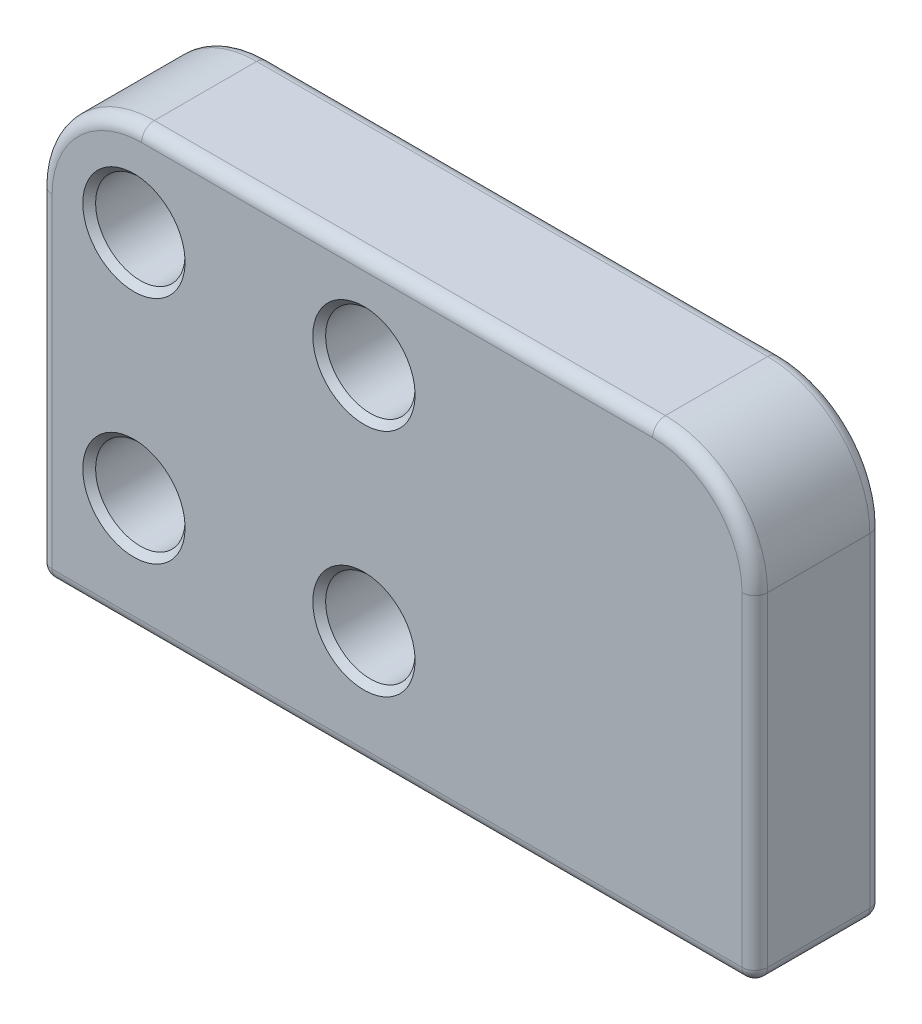
ISO-10303-21;
HEADER;
FILE_DESCRIPTION(('STEP AP214'),'2;1');
FILE_NAME('part.step','',(''),(''),'','','');
FILE_SCHEMA(('AUTOMOTIVE_DESIGN { 1 0 10303 214 1 1 1 1 }'));
ENDSEC;
DATA;
#1=APPLICATION_CONTEXT('core data for automotive mechanical design processes');
#2=APPLICATION_PROTOCOL_DEFINITION('international standard','automotive_design',2000,#1);
#3=PRODUCT_CONTEXT('',#1,'mechanical');
#4=PRODUCT('Part','Part','',(#3));
#5=PRODUCT_RELATED_PRODUCT_CATEGORY('part','',(#4));
#6=PRODUCT_DEFINITION_FORMATION('','',#4);
#7=PRODUCT_DEFINITION_CONTEXT('part definition',#1,'design');
#8=PRODUCT_DEFINITION('design','',#6,#7);
#9=PRODUCT_DEFINITION_SHAPE('','',#8);
#10=(LENGTH_UNIT() NAMED_UNIT(*) SI_UNIT(.MILLI.,.METRE.));
#11=(NAMED_UNIT(*) PLANE_ANGLE_UNIT() SI_UNIT($,.RADIAN.));
#12=(NAMED_UNIT(*) SI_UNIT($,.STERADIAN.) SOLID_ANGLE_UNIT());
#13=UNCERTAINTY_MEASURE_WITH_UNIT(LENGTH_MEASURE(1.E-05),#10,'distance_accuracy_value','');
#14=(GEOMETRIC_REPRESENTATION_CONTEXT(3) GLOBAL_UNCERTAINTY_ASSIGNED_CONTEXT((#13)) GLOBAL_UNIT_ASSIGNED_CONTEXT((#10,
#11,#12)) REPRESENTATION_CONTEXT('',''));
#15=CARTESIAN_POINT('',(0.,0.,0.));
#16=DIRECTION('',(0.,0.,1.));
#17=DIRECTION('',(1.,0.,0.));
#18=AXIS2_PLACEMENT_3D('',#15,#16,#17);
#19=CARTESIAN_POINT('',(24.7014572283037,41.,0.));
#20=DIRECTION('',(0.,1.,0.));
#21=DIRECTION('',(0.,0.,1.));
#22=AXIS2_PLACEMENT_3D('',#19,#20,#21);
#23=PLANE('',#22);
#24=DIRECTION('',(0.,0.,-1.));
#25=VECTOR('',#24,1.);
#26=CARTESIAN_POINT('',(9.,41.,0.));
#27=LINE('',#26,#25);
#28=CARTESIAN_POINT('',(9.,41.,1.));
#29=VERTEX_POINT('',#28);
#30=CARTESIAN_POINT('',(9.,41.,9.));
#31=VERTEX_POINT('',#30);
#32=EDGE_CURVE('E470',#29,#31,#27,.F.);
#33=ORIENTED_EDGE('',*,*,#32,.T.);
#34=DIRECTION('',(1.,0.,0.));
#35=VECTOR('',#34,1.);
#36=CARTESIAN_POINT('',(24.7014572283037,41.,9.));
#37=LINE('',#36,#35);
#38=CARTESIAN_POINT('',(-44.99,41.,9.));
#39=VERTEX_POINT('',#38);
#40=EDGE_CURVE('E227',#31,#39,#37,.F.);
#41=ORIENTED_EDGE('',*,*,#40,.T.);
#42=DIRECTION('',(0.,0.,1.));
#43=VECTOR('',#42,1.);
#44=CARTESIAN_POINT('',(-44.99,41.,0.));
#45=LINE('',#44,#43);
#46=CARTESIAN_POINT('',(-44.99,41.,1.));
#47=VERTEX_POINT('',#46);
#48=EDGE_CURVE('E476',#39,#47,#45,.F.);
#49=ORIENTED_EDGE('',*,*,#48,.T.);
#50=DIRECTION('',(1.,0.,0.));
#51=VECTOR('',#50,1.);
#52=CARTESIAN_POINT('',(10.,41.,1.));
#53=LINE('',#52,#51);
#54=EDGE_CURVE('E473',#47,#29,#53,.T.);
#55=ORIENTED_EDGE('',*,*,#54,.T.);
#56=EDGE_LOOP('',(#33,#41,#49,#55));
#57=FACE_BOUND('',#56,.T.);
#58=ADVANCED_FACE('F61',(#57),#23,.F.);
#59=CARTESIAN_POINT('',(-38.59,50.,10.));
#60=DIRECTION('',(0.,0.,-1.));
#61=DIRECTION('',(-1.,0.,0.));
#62=AXIS2_PLACEMENT_3D('',#59,#60,#61);
#63=CYLINDRICAL_SURFACE('',#62,3.5);
#64=CARTESIAN_POINT('',(-38.59,50.,0.499999999999994));
#65=DIRECTION('',(0.,0.,-1.));
#66=DIRECTION('',(-1.,0.,0.));
#67=AXIS2_PLACEMENT_3D('',#64,#65,#66);
#68=CIRCLE('',#67,3.5);
#69=CARTESIAN_POINT('',(-42.09,50.,0.499999999999994));
#70=VERTEX_POINT('',#69);
#71=EDGE_CURVE('E325',#70,#70,#68,.T.);
#72=ORIENTED_EDGE('',*,*,#71,.T.);
#73=EDGE_LOOP('',(#72));
#74=FACE_BOUND('',#73,.T.);
#75=CARTESIAN_POINT('',(-38.59,50.,9.49999999999999));
#76=DIRECTION('',(0.,0.,-1.));
#77=DIRECTION('',(-1.,0.,0.));
#78=AXIS2_PLACEMENT_3D('',#75,#76,#77);
#79=CIRCLE('',#78,3.5);
#80=CARTESIAN_POINT('',(-42.09,50.,9.49999999999999));
#81=VERTEX_POINT('',#80);
#82=EDGE_CURVE('E321',#81,#81,#79,.F.);
#83=ORIENTED_EDGE('',*,*,#82,.T.);
#84=EDGE_LOOP('',(#83));
#85=FACE_BOUND('',#84,.T.);
#86=ADVANCED_FACE('F354',(#74,#85),#63,.F.);
#87=CARTESIAN_POINT('',(-20.59,68.,10.));
#88=DIRECTION('',(0.,0.,-1.));
#89=DIRECTION('',(-1.,0.,0.));
#90=AXIS2_PLACEMENT_3D('',#87,#88,#89);
#91=CYLINDRICAL_SURFACE('',#90,3.5);
#92=CARTESIAN_POINT('',(-20.59,68.,0.500000000000007));
#93=DIRECTION('',(0.,0.,-1.));
#94=DIRECTION('',(-1.,0.,0.));
#95=AXIS2_PLACEMENT_3D('',#92,#93,#94);
#96=CIRCLE('',#95,3.5);
#97=CARTESIAN_POINT('',(-24.09,68.,0.500000000000007));
#98=VERTEX_POINT('',#97);
#99=EDGE_CURVE('E333',#98,#98,#96,.T.);
#100=ORIENTED_EDGE('',*,*,#99,.T.);
#101=EDGE_LOOP('',(#100));
#102=FACE_BOUND('',#101,.T.);
#103=CARTESIAN_POINT('',(-20.59,68.,9.49999999999999));
#104=DIRECTION('',(0.,0.,-1.));
#105=DIRECTION('',(-1.,0.,0.));
#106=AXIS2_PLACEMENT_3D('',#103,#104,#105);
#107=CIRCLE('',#106,3.5);
#108=CARTESIAN_POINT('',(-24.09,68.,9.49999999999999));
#109=VERTEX_POINT('',#108);
#110=EDGE_CURVE('E329',#109,#109,#107,.F.);
#111=ORIENTED_EDGE('',*,*,#110,.T.);
#112=EDGE_LOOP('',(#111));
#113=FACE_BOUND('',#112,.T.);
#114=ADVANCED_FACE('F362',(#102,#113),#91,.F.);
#115=CARTESIAN_POINT('',(-20.59,50.,10.));
#116=DIRECTION('',(0.,0.,-1.));
#117=DIRECTION('',(-1.,0.,0.));
#118=AXIS2_PLACEMENT_3D('',#115,#116,#117);
#119=CYLINDRICAL_SURFACE('',#118,3.5);
#120=CARTESIAN_POINT('',(-20.59,50.,0.500000000000007));
#121=DIRECTION('',(0.,0.,-1.));
#122=DIRECTION('',(-1.,0.,0.));
#123=AXIS2_PLACEMENT_3D('',#120,#121,#122);
#124=CIRCLE('',#123,3.5);
#125=CARTESIAN_POINT('',(-24.09,50.,0.500000000000007));
#126=VERTEX_POINT('',#125);
#127=EDGE_CURVE('E301',#126,#126,#124,.T.);
#128=ORIENTED_EDGE('',*,*,#127,.T.);
#129=EDGE_LOOP('',(#128));
#130=FACE_BOUND('',#129,.T.);
#131=CARTESIAN_POINT('',(-20.59,50.,9.49999999999999));
#132=DIRECTION('',(0.,0.,-1.));
#133=DIRECTION('',(-1.,0.,0.));
#134=AXIS2_PLACEMENT_3D('',#131,#132,#133);
#135=CIRCLE('',#134,3.5);
#136=CARTESIAN_POINT('',(-24.09,50.,9.49999999999999));
#137=VERTEX_POINT('',#136);
#138=EDGE_CURVE('E297',#137,#137,#135,.F.);
#139=ORIENTED_EDGE('',*,*,#138,.T.);
#140=EDGE_LOOP('',(#139));
#141=FACE_BOUND('',#140,.T.);
#142=ADVANCED_FACE('F570',(#130,#141),#119,.F.);
#143=CARTESIAN_POINT('',(-38.59,68.,10.));
#144=DIRECTION('',(0.,0.,-1.));
#145=DIRECTION('',(-1.,0.,0.));
#146=AXIS2_PLACEMENT_3D('',#143,#144,#145);
#147=CYLINDRICAL_SURFACE('',#146,3.5);
#148=CARTESIAN_POINT('',(-38.59,68.,0.499999999999994));
#149=DIRECTION('',(0.,0.,-1.));
#150=DIRECTION('',(-1.,0.,0.));
#151=AXIS2_PLACEMENT_3D('',#148,#149,#150);
#152=CIRCLE('',#151,3.5);
#153=CARTESIAN_POINT('',(-42.09,68.,0.499999999999994));
#154=VERTEX_POINT('',#153);
#155=EDGE_CURVE('E12',#154,#154,#152,.T.);
#156=ORIENTED_EDGE('',*,*,#155,.T.);
#157=EDGE_LOOP('',(#156));
#158=FACE_BOUND('',#157,.T.);
#159=CARTESIAN_POINT('',(-38.59,68.,9.49999999999999));
#160=DIRECTION('',(0.,0.,-1.));
#161=DIRECTION('',(-1.,0.,0.));
#162=AXIS2_PLACEMENT_3D('',#159,#160,#161);
#163=CIRCLE('',#162,3.5);
#164=CARTESIAN_POINT('',(-42.09,68.,9.49999999999999));
#165=VERTEX_POINT('',#164);
#166=EDGE_CURVE('E71',#165,#165,#163,.F.);
#167=ORIENTED_EDGE('',*,*,#166,.T.);
#168=EDGE_LOOP('',(#167));
#169=FACE_BOUND('',#168,.T.);
#170=ADVANCED_FACE('F341',(#158,#169),#147,.F.);
#171=CARTESIAN_POINT('',(-45.99,75.4,10.));
#172=DIRECTION('',(0.,-1.,0.));
#173=DIRECTION('',(0.,0.,-1.));
#174=AXIS2_PLACEMENT_3D('',#171,#172,#173);
#175=PLANE('',#174);
#176=DIRECTION('',(0.,0.,-1.));
#177=VECTOR('',#176,1.);
#178=CARTESIAN_POINT('',(-37.99,75.4,10.));
#179=LINE('',#178,#177);
#180=CARTESIAN_POINT('',(-37.99,75.4,0.999999999999999));
#181=VERTEX_POINT('',#180);
#182=CARTESIAN_POINT('',(-37.99,75.4,9.));
#183=VERTEX_POINT('',#182);
#184=EDGE_CURVE('E214',#181,#183,#179,.F.);
#185=ORIENTED_EDGE('',*,*,#184,.T.);
#186=DIRECTION('',(-1.,0.,0.));
#187=VECTOR('',#186,1.);
#188=CARTESIAN_POINT('',(-45.99,75.4,9.));
#189=LINE('',#188,#187);
#190=CARTESIAN_POINT('',(1.99999999999999,75.4,9.));
#191=VERTEX_POINT('',#190);
#192=EDGE_CURVE('E416',#183,#191,#189,.F.);
#193=ORIENTED_EDGE('',*,*,#192,.T.);
#194=DIRECTION('',(0.,0.,-1.));
#195=VECTOR('',#194,1.);
#196=CARTESIAN_POINT('',(1.99999999999999,75.4,10.));
#197=LINE('',#196,#195);
#198=CARTESIAN_POINT('',(1.99999999999999,75.4,0.999999999999999));
#199=VERTEX_POINT('',#198);
#200=EDGE_CURVE('E395',#191,#199,#197,.T.);
#201=ORIENTED_EDGE('',*,*,#200,.T.);
#202=DIRECTION('',(-1.,0.,0.));
#203=VECTOR('',#202,1.);
#204=CARTESIAN_POINT('',(-37.99,75.4,0.999999999999999));
#205=LINE('',#204,#203);
#206=EDGE_CURVE('E445',#199,#181,#205,.T.);
#207=ORIENTED_EDGE('',*,*,#206,.T.);
#208=EDGE_LOOP('',(#185,#193,#201,#207));
#209=FACE_BOUND('',#208,.T.);
#210=ADVANCED_FACE('F383',(#209),#175,.F.);
#211=CARTESIAN_POINT('',(1.99999999999999,67.4,10.));
#212=DIRECTION('',(0.,0.,-1.));
#213=DIRECTION('',(-1.,0.,0.));
#214=AXIS2_PLACEMENT_3D('',#211,#212,#213);
#215=CYLINDRICAL_SURFACE('',#214,8.);
#216=ORIENTED_EDGE('',*,*,#200,.F.);
#217=CARTESIAN_POINT('',(1.99999999999999,67.4,9.));
#218=DIRECTION('',(0.,0.,-1.));
#219=DIRECTION('',(-1.,0.,0.));
#220=AXIS2_PLACEMENT_3D('',#217,#218,#219);
#221=CIRCLE('',#220,8.);
#222=CARTESIAN_POINT('',(9.99999999999999,67.4,9.));
#223=VERTEX_POINT('',#222);
#224=EDGE_CURVE('E398',#191,#223,#221,.T.);
#225=ORIENTED_EDGE('',*,*,#224,.T.);
#226=DIRECTION('',(0.,0.,-1.));
#227=VECTOR('',#226,1.);
#228=CARTESIAN_POINT('',(9.99999999999999,67.4,10.));
#229=LINE('',#228,#227);
#230=CARTESIAN_POINT('',(9.99999999999999,67.4,0.999999999999999));
#231=VERTEX_POINT('',#230);
#232=EDGE_CURVE('E280',#231,#223,#229,.F.);
#233=ORIENTED_EDGE('',*,*,#232,.F.);
#234=CARTESIAN_POINT('',(1.99999999999999,67.4,0.999999999999999));
#235=DIRECTION('',(0.,0.,-1.));
#236=DIRECTION('',(-1.,0.,0.));
#237=AXIS2_PLACEMENT_3D('',#234,#235,#236);
#238=CIRCLE('',#237,8.);
#239=EDGE_CURVE('E400',#231,#199,#238,.F.);
#240=ORIENTED_EDGE('',*,*,#239,.T.);
#241=EDGE_LOOP('',(#216,#225,#233,#240));
#242=FACE_BOUND('',#241,.T.);
#243=ADVANCED_FACE('F386',(#242),#215,.T.);
#244=CARTESIAN_POINT('',(-37.99,67.4,10.));
#245=DIRECTION('',(0.,0.,-1.));
#246=DIRECTION('',(-1.,0.,0.));
#247=AXIS2_PLACEMENT_3D('',#244,#245,#246);
#248=CYLINDRICAL_SURFACE('',#247,8.);
#249=DIRECTION('',(0.,0.,-1.));
#250=VECTOR('',#249,1.);
#251=CARTESIAN_POINT('',(-45.99,67.4,10.));
#252=LINE('',#251,#250);
#253=CARTESIAN_POINT('',(-45.99,67.4,9.));
#254=VERTEX_POINT('',#253);
#255=CARTESIAN_POINT('',(-45.99,67.4,0.999999999999999));
#256=VERTEX_POINT('',#255);
#257=EDGE_CURVE('E403',#254,#256,#252,.T.);
#258=ORIENTED_EDGE('',*,*,#257,.F.);
#259=CARTESIAN_POINT('',(-37.99,67.4,9.));
#260=DIRECTION('',(0.,0.,-1.));
#261=DIRECTION('',(-1.,0.,0.));
#262=AXIS2_PLACEMENT_3D('',#259,#260,#261);
#263=CIRCLE('',#262,8.);
#264=EDGE_CURVE('E442',#254,#183,#263,.T.);
#265=ORIENTED_EDGE('',*,*,#264,.T.);
#266=ORIENTED_EDGE('',*,*,#184,.F.);
#267=CARTESIAN_POINT('',(-37.99,67.4,0.999999999999999));
#268=DIRECTION('',(0.,0.,-1.));
#269=DIRECTION('',(-1.,0.,0.));
#270=AXIS2_PLACEMENT_3D('',#267,#268,#269);
#271=CIRCLE('',#270,8.);
#272=EDGE_CURVE('E439',#181,#256,#271,.F.);
#273=ORIENTED_EDGE('',*,*,#272,.T.);
#274=EDGE_LOOP('',(#258,#265,#266,#273));
#275=FACE_BOUND('',#274,.T.);
#276=ADVANCED_FACE('F384',(#275),#248,.T.);
#277=CARTESIAN_POINT('',(0.,0.,10.));
#278=DIRECTION('',(0.,0.,-1.));
#279=DIRECTION('',(-1.,0.,0.));
#280=AXIS2_PLACEMENT_3D('',#277,#278,#279);
#281=PLANE('',#280);
#282=CARTESIAN_POINT('',(-20.59,50.,10.));
#283=DIRECTION('',(0.,0.,-1.));
#284=DIRECTION('',(-1.,0.,0.));
#285=AXIS2_PLACEMENT_3D('',#282,#283,#284);
#286=CIRCLE('',#285,4.00000000000001);
#287=CARTESIAN_POINT('',(-24.59,50.,10.));
#288=VERTEX_POINT('',#287);
#289=EDGE_CURVE('E317',#288,#288,#286,.T.);
#290=ORIENTED_EDGE('',*,*,#289,.T.);
#291=EDGE_LOOP('',(#290));
#292=FACE_BOUND('',#291,.T.);
#293=CARTESIAN_POINT('',(-38.59,50.,10.));
#294=DIRECTION('',(0.,0.,-1.));
#295=DIRECTION('',(-1.,0.,0.));
#296=AXIS2_PLACEMENT_3D('',#293,#294,#295);
#297=CIRCLE('',#296,4.00000000000002);
#298=CARTESIAN_POINT('',(-42.59,50.,10.));
#299=VERTEX_POINT('',#298);
#300=EDGE_CURVE('E313',#299,#299,#297,.T.);
#301=ORIENTED_EDGE('',*,*,#300,.T.);
#302=EDGE_LOOP('',(#301));
#303=FACE_BOUND('',#302,.T.);
#304=CARTESIAN_POINT('',(-20.59,68.,10.));
#305=DIRECTION('',(0.,0.,-1.));
#306=DIRECTION('',(-1.,0.,0.));
#307=AXIS2_PLACEMENT_3D('',#304,#305,#306);
#308=CIRCLE('',#307,4.00000000000002);
#309=CARTESIAN_POINT('',(-24.59,68.,10.));
#310=VERTEX_POINT('',#309);
#311=EDGE_CURVE('E309',#310,#310,#308,.T.);
#312=ORIENTED_EDGE('',*,*,#311,.T.);
#313=EDGE_LOOP('',(#312));
#314=FACE_BOUND('',#313,.T.);
#315=CARTESIAN_POINT('',(-38.59,68.,10.));
#316=DIRECTION('',(0.,0.,-1.));
#317=DIRECTION('',(-1.,0.,0.));
#318=AXIS2_PLACEMENT_3D('',#315,#316,#317);
#319=CIRCLE('',#318,4.00000000000002);
#320=CARTESIAN_POINT('',(-42.59,68.,10.));
#321=VERTEX_POINT('',#320);
#322=EDGE_CURVE('E305',#321,#321,#319,.T.);
#323=ORIENTED_EDGE('',*,*,#322,.T.);
#324=EDGE_LOOP('',(#323));
#325=FACE_BOUND('',#324,.T.);
#326=CARTESIAN_POINT('',(-37.99,67.4,10.));
#327=DIRECTION('',(0.,0.,-1.));
#328=DIRECTION('',(-1.,0.,0.));
#329=AXIS2_PLACEMENT_3D('',#326,#327,#328);
#330=CIRCLE('',#329,7.);
#331=CARTESIAN_POINT('',(-37.99,74.4,10.));
#332=VERTEX_POINT('',#331);
#333=CARTESIAN_POINT('',(-44.99,67.4,10.));
#334=VERTEX_POINT('',#333);
#335=EDGE_CURVE('E421',#332,#334,#330,.F.);
#336=ORIENTED_EDGE('',*,*,#335,.T.);
#337=DIRECTION('',(0.,-1.,0.));
#338=VECTOR('',#337,1.);
#339=CARTESIAN_POINT('',(-44.99,0.,10.));
#340=LINE('',#339,#338);
#341=CARTESIAN_POINT('',(-44.99,42.,10.));
#342=VERTEX_POINT('',#341);
#343=EDGE_CURVE('E197',#334,#342,#340,.T.);
#344=ORIENTED_EDGE('',*,*,#343,.T.);
#345=DIRECTION('',(1.,0.,0.));
#346=VECTOR('',#345,1.);
#347=CARTESIAN_POINT('',(0.,42.,10.));
#348=LINE('',#347,#346);
#349=CARTESIAN_POINT('',(9.,42.,10.));
#350=VERTEX_POINT('',#349);
#351=EDGE_CURVE('E191',#342,#350,#348,.T.);
#352=ORIENTED_EDGE('',*,*,#351,.T.);
#353=DIRECTION('',(0.,1.,0.));
#354=VECTOR('',#353,1.);
#355=CARTESIAN_POINT('',(9.,0.,10.));
#356=LINE('',#355,#354);
#357=CARTESIAN_POINT('',(8.99999999999999,67.4,10.));
#358=VERTEX_POINT('',#357);
#359=EDGE_CURVE('E194',#350,#358,#356,.T.);
#360=ORIENTED_EDGE('',*,*,#359,.T.);
#361=CARTESIAN_POINT('',(1.99999999999999,67.4,10.));
#362=DIRECTION('',(0.,0.,-1.));
#363=DIRECTION('',(-1.,0.,0.));
#364=AXIS2_PLACEMENT_3D('',#361,#362,#363);
#365=CIRCLE('',#364,7.);
#366=CARTESIAN_POINT('',(1.99999999999999,74.4,10.));
#367=VERTEX_POINT('',#366);
#368=EDGE_CURVE('E202',#358,#367,#365,.F.);
#369=ORIENTED_EDGE('',*,*,#368,.T.);
#370=DIRECTION('',(-1.,0.,0.));
#371=VECTOR('',#370,1.);
#372=CARTESIAN_POINT('',(0.,74.4,10.));
#373=LINE('',#372,#371);
#374=EDGE_CURVE('E418',#367,#332,#373,.T.);
#375=ORIENTED_EDGE('',*,*,#374,.T.);
#376=EDGE_LOOP('',(#336,#344,#352,#360,#369,#375));
#377=FACE_BOUND('',#376,.T.);
#378=ADVANCED_FACE('F193',(#292,#303,#314,#325,#377),#281,.F.);
#379=CARTESIAN_POINT('',(0.,0.,0.));
#380=DIRECTION('',(0.,0.,-1.));
#381=DIRECTION('',(-1.,0.,0.));
#382=AXIS2_PLACEMENT_3D('',#379,#380,#381);
#383=PLANE('',#382);
#384=CARTESIAN_POINT('',(-20.59,50.,0.));
#385=DIRECTION('',(0.,0.,-1.));
#386=DIRECTION('',(-1.,0.,0.));
#387=AXIS2_PLACEMENT_3D('',#384,#385,#386);
#388=CIRCLE('',#387,4.00000000000001);
#389=CARTESIAN_POINT('',(-24.59,50.,0.));
#390=VERTEX_POINT('',#389);
#391=EDGE_CURVE('E293',#390,#390,#388,.F.);
#392=ORIENTED_EDGE('',*,*,#391,.T.);
#393=EDGE_LOOP('',(#392));
#394=FACE_BOUND('',#393,.T.);
#395=CARTESIAN_POINT('',(-38.59,50.,0.));
#396=DIRECTION('',(0.,0.,-1.));
#397=DIRECTION('',(-1.,0.,0.));
#398=AXIS2_PLACEMENT_3D('',#395,#396,#397);
#399=CIRCLE('',#398,4.);
#400=CARTESIAN_POINT('',(-42.59,50.,0.));
#401=VERTEX_POINT('',#400);
#402=EDGE_CURVE('E289',#401,#401,#399,.F.);
#403=ORIENTED_EDGE('',*,*,#402,.T.);
#404=EDGE_LOOP('',(#403));
#405=FACE_BOUND('',#404,.T.);
#406=CARTESIAN_POINT('',(-20.59,68.,0.));
#407=DIRECTION('',(0.,0.,-1.));
#408=DIRECTION('',(-1.,0.,0.));
#409=AXIS2_PLACEMENT_3D('',#406,#407,#408);
#410=CIRCLE('',#409,4.);
#411=CARTESIAN_POINT('',(-24.59,68.,0.));
#412=VERTEX_POINT('',#411);
#413=EDGE_CURVE('E285',#412,#412,#410,.F.);
#414=ORIENTED_EDGE('',*,*,#413,.T.);
#415=EDGE_LOOP('',(#414));
#416=FACE_BOUND('',#415,.T.);
#417=CARTESIAN_POINT('',(-38.59,68.,0.));
#418=DIRECTION('',(0.,0.,-1.));
#419=DIRECTION('',(-1.,0.,0.));
#420=AXIS2_PLACEMENT_3D('',#417,#418,#419);
#421=CIRCLE('',#420,4.);
#422=CARTESIAN_POINT('',(-42.59,68.,0.));
#423=VERTEX_POINT('',#422);
#424=EDGE_CURVE('E281',#423,#423,#421,.F.);
#425=ORIENTED_EDGE('',*,*,#424,.T.);
#426=EDGE_LOOP('',(#425));
#427=FACE_BOUND('',#426,.T.);
#428=DIRECTION('',(1.,0.,0.));
#429=VECTOR('',#428,1.);
#430=CARTESIAN_POINT('',(-45.99,42.,0.));
#431=LINE('',#430,#429);
#432=CARTESIAN_POINT('',(9.,42.,0.));
#433=VERTEX_POINT('',#432);
#434=CARTESIAN_POINT('',(-44.99,42.,0.));
#435=VERTEX_POINT('',#434);
#436=EDGE_CURVE('E454',#433,#435,#431,.F.);
#437=ORIENTED_EDGE('',*,*,#436,.T.);
#438=DIRECTION('',(0.,-1.,0.));
#439=VECTOR('',#438,1.);
#440=CARTESIAN_POINT('',(-44.99,67.4,0.));
#441=LINE('',#440,#439);
#442=CARTESIAN_POINT('',(-44.99,67.4,0.));
#443=VERTEX_POINT('',#442);
#444=EDGE_CURVE('E466',#435,#443,#441,.F.);
#445=ORIENTED_EDGE('',*,*,#444,.T.);
#446=CARTESIAN_POINT('',(-37.99,67.4,0.));
#447=DIRECTION('',(0.,0.,-1.));
#448=DIRECTION('',(-1.,0.,0.));
#449=AXIS2_PLACEMENT_3D('',#446,#447,#448);
#450=CIRCLE('',#449,7.);
#451=CARTESIAN_POINT('',(-37.99,74.4,0.));
#452=VERTEX_POINT('',#451);
#453=EDGE_CURVE('E463',#443,#452,#450,.T.);
#454=ORIENTED_EDGE('',*,*,#453,.T.);
#455=DIRECTION('',(-1.,0.,0.));
#456=VECTOR('',#455,1.);
#457=CARTESIAN_POINT('',(1.99999999999998,74.4,0.));
#458=LINE('',#457,#456);
#459=CARTESIAN_POINT('',(1.99999999999999,74.4,0.));
#460=VERTEX_POINT('',#459);
#461=EDGE_CURVE('E460',#452,#460,#458,.F.);
#462=ORIENTED_EDGE('',*,*,#461,.T.);
#463=CARTESIAN_POINT('',(1.99999999999999,67.4,0.));
#464=DIRECTION('',(0.,0.,-1.));
#465=DIRECTION('',(-1.,0.,0.));
#466=AXIS2_PLACEMENT_3D('',#463,#464,#465);
#467=CIRCLE('',#466,7.);
#468=CARTESIAN_POINT('',(9.,67.4,0.));
#469=VERTEX_POINT('',#468);
#470=EDGE_CURVE('E457',#460,#469,#467,.T.);
#471=ORIENTED_EDGE('',*,*,#470,.T.);
#472=DIRECTION('',(0.,1.,0.));
#473=VECTOR('',#472,1.);
#474=CARTESIAN_POINT('',(9.,41.,0.));
#475=LINE('',#474,#473);
#476=EDGE_CURVE('E410',#469,#433,#475,.F.);
#477=ORIENTED_EDGE('',*,*,#476,.T.);
#478=EDGE_LOOP('',(#437,#445,#454,#462,#471,#477));
#479=FACE_BOUND('',#478,.T.);
#480=ADVANCED_FACE('F378',(#394,#405,#416,#427,#479),#383,.T.);
#481=CARTESIAN_POINT('',(-45.99,-12.5,10.));
#482=DIRECTION('',(1.,0.,0.));
#483=DIRECTION('',(0.,0.,-1.));
#484=AXIS2_PLACEMENT_3D('',#481,#482,#483);
#485=PLANE('',#484);
#486=DIRECTION('',(0.,0.,1.));
#487=VECTOR('',#486,1.);
#488=CARTESIAN_POINT('',(-45.99,42.,10.));
#489=LINE('',#488,#487);
#490=CARTESIAN_POINT('',(-45.99,42.,0.999999999999999));
#491=VERTEX_POINT('',#490);
#492=CARTESIAN_POINT('',(-45.99,42.,9.));
#493=VERTEX_POINT('',#492);
#494=EDGE_CURVE('E429',#491,#493,#489,.T.);
#495=ORIENTED_EDGE('',*,*,#494,.T.);
#496=DIRECTION('',(0.,-1.,0.));
#497=VECTOR('',#496,1.);
#498=CARTESIAN_POINT('',(-45.99,-12.5,9.));
#499=LINE('',#498,#497);
#500=EDGE_CURVE('E435',#493,#254,#499,.F.);
#501=ORIENTED_EDGE('',*,*,#500,.T.);
#502=ORIENTED_EDGE('',*,*,#257,.T.);
#503=DIRECTION('',(0.,-1.,0.));
#504=VECTOR('',#503,1.);
#505=CARTESIAN_POINT('',(-45.99,41.,0.999999999999999));
#506=LINE('',#505,#504);
#507=EDGE_CURVE('E432',#256,#491,#506,.T.);
#508=ORIENTED_EDGE('',*,*,#507,.T.);
#509=EDGE_LOOP('',(#495,#501,#502,#508));
#510=FACE_BOUND('',#509,.T.);
#511=ADVANCED_FACE('F369',(#510),#485,.F.);
#512=CARTESIAN_POINT('',(9.99999999999999,75.4,10.));
#513=DIRECTION('',(-1.,0.,0.));
#514=DIRECTION('',(0.,-1.,0.));
#515=AXIS2_PLACEMENT_3D('',#512,#513,#514);
#516=PLANE('',#515);
#517=ORIENTED_EDGE('',*,*,#232,.T.);
#518=DIRECTION('',(0.,1.,0.));
#519=VECTOR('',#518,1.);
#520=CARTESIAN_POINT('',(9.99999999999999,75.4,9.));
#521=LINE('',#520,#519);
#522=CARTESIAN_POINT('',(10.,42.,9.));
#523=VERTEX_POINT('',#522);
#524=EDGE_CURVE('E81',#223,#523,#521,.F.);
#525=ORIENTED_EDGE('',*,*,#524,.T.);
#526=DIRECTION('',(0.,0.,-1.));
#527=VECTOR('',#526,1.);
#528=CARTESIAN_POINT('',(10.,42.,10.));
#529=LINE('',#528,#527);
#530=CARTESIAN_POINT('',(10.,42.,0.999999999999999));
#531=VERTEX_POINT('',#530);
#532=EDGE_CURVE('E88',#523,#531,#529,.T.);
#533=ORIENTED_EDGE('',*,*,#532,.T.);
#534=DIRECTION('',(0.,1.,0.));
#535=VECTOR('',#534,1.);
#536=CARTESIAN_POINT('',(9.99999999999999,67.4,0.999999999999999));
#537=LINE('',#536,#535);
#538=EDGE_CURVE('E481',#531,#231,#537,.T.);
#539=ORIENTED_EDGE('',*,*,#538,.T.);
#540=EDGE_LOOP('',(#517,#525,#533,#539));
#541=FACE_BOUND('',#540,.T.);
#542=ADVANCED_FACE('F357',(#541),#516,.F.);
#543=CARTESIAN_POINT('',(1.99999999999999,67.4,0.999999999999999));
#544=DIRECTION('',(0.,0.,-1.));
#545=DIRECTION('',(-1.,0.,0.));
#546=AXIS2_PLACEMENT_3D('',#543,#544,#545);
#547=TOROIDAL_SURFACE('',#546,7.,1.);
#548=CARTESIAN_POINT('',(1.99999999999999,74.4,0.999999999999999));
#549=DIRECTION('',(-1.,0.,0.));
#550=DIRECTION('',(0.,0.,1.));
#551=AXIS2_PLACEMENT_3D('',#548,#549,#550);
#552=CIRCLE('',#551,1.);
#553=EDGE_CURVE('E272',#199,#460,#552,.T.);
#554=ORIENTED_EDGE('',*,*,#553,.F.);
#555=ORIENTED_EDGE('',*,*,#239,.F.);
#556=CARTESIAN_POINT('',(8.99999999999999,67.4,1.));
#557=DIRECTION('',(0.,-1.,0.));
#558=DIRECTION('',(0.,0.,-1.));
#559=AXIS2_PLACEMENT_3D('',#556,#557,#558);
#560=CIRCLE('',#559,1.);
#561=EDGE_CURVE('E276',#469,#231,#560,.T.);
#562=ORIENTED_EDGE('',*,*,#561,.F.);
#563=ORIENTED_EDGE('',*,*,#470,.F.);
#564=EDGE_LOOP('',(#554,#555,#562,#563));
#565=FACE_BOUND('',#564,.T.);
#566=ADVANCED_FACE('F365',(#565),#547,.T.);
#567=CARTESIAN_POINT('',(8.99999999999999,75.4,0.999999999999999));
#568=DIRECTION('',(0.,-1.,0.));
#569=DIRECTION('',(1.,0.,0.));
#570=AXIS2_PLACEMENT_3D('',#567,#568,#569);
#571=CYLINDRICAL_SURFACE('',#570,1.);
#572=ORIENTED_EDGE('',*,*,#561,.T.);
#573=ORIENTED_EDGE('',*,*,#538,.F.);
#574=CARTESIAN_POINT('',(9.,42.,1.));
#575=DIRECTION('',(0.,-1.,0.));
#576=DIRECTION('',(0.,0.,-1.));
#577=AXIS2_PLACEMENT_3D('',#574,#575,#576);
#578=CIRCLE('',#577,1.);
#579=EDGE_CURVE('E268',#433,#531,#578,.T.);
#580=ORIENTED_EDGE('',*,*,#579,.F.);
#581=ORIENTED_EDGE('',*,*,#476,.F.);
#582=EDGE_LOOP('',(#572,#573,#580,#581));
#583=FACE_BOUND('',#582,.T.);
#584=ADVANCED_FACE('F375',(#583),#571,.T.);
#585=CARTESIAN_POINT('',(-45.99,74.4,0.999999999999999));
#586=DIRECTION('',(1.,0.,0.));
#587=DIRECTION('',(0.,0.,-1.));
#588=AXIS2_PLACEMENT_3D('',#585,#586,#587);
#589=CYLINDRICAL_SURFACE('',#588,1.);
#590=ORIENTED_EDGE('',*,*,#553,.T.);
#591=ORIENTED_EDGE('',*,*,#461,.F.);
#592=CARTESIAN_POINT('',(-37.99,74.4,0.999999999999999));
#593=DIRECTION('',(-1.,0.,0.));
#594=DIRECTION('',(0.,0.,1.));
#595=AXIS2_PLACEMENT_3D('',#592,#593,#594);
#596=CIRCLE('',#595,1.);
#597=EDGE_CURVE('E264',#181,#452,#596,.T.);
#598=ORIENTED_EDGE('',*,*,#597,.F.);
#599=ORIENTED_EDGE('',*,*,#206,.F.);
#600=EDGE_LOOP('',(#590,#591,#598,#599));
#601=FACE_BOUND('',#600,.T.);
#602=ADVANCED_FACE('F537',(#601),#589,.T.);
#603=CARTESIAN_POINT('',(9.,42.,1.));
#604=DIRECTION('',(1.,0.,0.));
#605=DIRECTION('',(0.,0.,-1.));
#606=AXIS2_PLACEMENT_3D('',#603,#604,#605);
#607=SPHERICAL_SURFACE('',#606,1.);
#608=CARTESIAN_POINT('',(9.,42.,1.));
#609=DIRECTION('',(1.,0.,0.));
#610=DIRECTION('',(0.,0.,-1.));
#611=AXIS2_PLACEMENT_3D('',#608,#609,#610);
#612=CIRCLE('',#611,1.);
#613=EDGE_CURVE('E256',#433,#29,#612,.F.);
#614=ORIENTED_EDGE('',*,*,#613,.F.);
#615=ORIENTED_EDGE('',*,*,#579,.T.);
#616=CARTESIAN_POINT('',(9.,42.,0.999999999999999));
#617=DIRECTION('',(0.,0.,-1.));
#618=DIRECTION('',(0.,1.,0.));
#619=AXIS2_PLACEMENT_3D('',#616,#617,#618);
#620=CIRCLE('',#619,1.);
#621=EDGE_CURVE('E260',#29,#531,#620,.F.);
#622=ORIENTED_EDGE('',*,*,#621,.F.);
#623=EDGE_LOOP('',(#614,#615,#622));
#624=FACE_BOUND('',#623,.T.);
#625=ADVANCED_FACE('F524',(#624),#607,.T.);
#626=CARTESIAN_POINT('',(-37.99,67.4,0.999999999999999));
#627=DIRECTION('',(0.,0.,-1.));
#628=DIRECTION('',(-1.,0.,0.));
#629=AXIS2_PLACEMENT_3D('',#626,#627,#628);
#630=TOROIDAL_SURFACE('',#629,7.,1.);
#631=ORIENTED_EDGE('',*,*,#597,.T.);
#632=ORIENTED_EDGE('',*,*,#453,.F.);
#633=CARTESIAN_POINT('',(-44.99,67.4,0.999999999999999));
#634=DIRECTION('',(0.,-1.,0.));
#635=DIRECTION('',(0.,0.,-1.));
#636=AXIS2_PLACEMENT_3D('',#633,#634,#635);
#637=CIRCLE('',#636,1.);
#638=EDGE_CURVE('E253',#256,#443,#637,.T.);
#639=ORIENTED_EDGE('',*,*,#638,.F.);
#640=ORIENTED_EDGE('',*,*,#272,.F.);
#641=EDGE_LOOP('',(#631,#632,#639,#640));
#642=FACE_BOUND('',#641,.T.);
#643=ADVANCED_FACE('F552',(#642),#630,.T.);
#644=CARTESIAN_POINT('',(9.,0.,9.));
#645=DIRECTION('',(0.,1.,0.));
#646=DIRECTION('',(-1.,0.,0.));
#647=AXIS2_PLACEMENT_3D('',#644,#645,#646);
#648=CYLINDRICAL_SURFACE('',#647,1.);
#649=CARTESIAN_POINT('',(9.,42.,9.));
#650=DIRECTION('',(0.,-1.,0.));
#651=DIRECTION('',(0.,0.,-1.));
#652=AXIS2_PLACEMENT_3D('',#649,#650,#651);
#653=CIRCLE('',#652,1.);
#654=EDGE_CURVE('E208',#523,#350,#653,.T.);
#655=ORIENTED_EDGE('',*,*,#654,.F.);
#656=ORIENTED_EDGE('',*,*,#524,.F.);
#657=CARTESIAN_POINT('',(8.99999999999999,67.4,9.));
#658=DIRECTION('',(0.,1.,0.));
#659=DIRECTION('',(0.,0.,1.));
#660=AXIS2_PLACEMENT_3D('',#657,#658,#659);
#661=CIRCLE('',#660,1.);
#662=EDGE_CURVE('E211',#358,#223,#661,.T.);
#663=ORIENTED_EDGE('',*,*,#662,.F.);
#664=ORIENTED_EDGE('',*,*,#359,.F.);
#665=EDGE_LOOP('',(#655,#656,#663,#664));
#666=FACE_BOUND('',#665,.T.);
#667=ADVANCED_FACE('F207',(#666),#648,.T.);
#668=CARTESIAN_POINT('',(9.,42.,10.));
#669=DIRECTION('',(0.,0.,-1.));
#670=DIRECTION('',(-1.,0.,0.));
#671=AXIS2_PLACEMENT_3D('',#668,#669,#670);
#672=CYLINDRICAL_SURFACE('',#671,1.);
#673=ORIENTED_EDGE('',*,*,#621,.T.);
#674=ORIENTED_EDGE('',*,*,#532,.F.);
#675=CARTESIAN_POINT('',(9.,42.,9.));
#676=DIRECTION('',(0.,0.,1.));
#677=DIRECTION('',(1.,0.,0.));
#678=AXIS2_PLACEMENT_3D('',#675,#676,#677);
#679=CIRCLE('',#678,1.);
#680=EDGE_CURVE('E222',#31,#523,#679,.T.);
#681=ORIENTED_EDGE('',*,*,#680,.F.);
#682=ORIENTED_EDGE('',*,*,#32,.F.);
#683=EDGE_LOOP('',(#673,#674,#681,#682));
#684=FACE_BOUND('',#683,.T.);
#685=ADVANCED_FACE('F520',(#684),#672,.T.);
#686=CARTESIAN_POINT('',(24.7014572283037,42.,1.));
#687=DIRECTION('',(-1.,0.,0.));
#688=DIRECTION('',(0.,0.,1.));
#689=AXIS2_PLACEMENT_3D('',#686,#687,#688);
#690=CYLINDRICAL_SURFACE('',#689,1.);
#691=ORIENTED_EDGE('',*,*,#613,.T.);
#692=ORIENTED_EDGE('',*,*,#54,.F.);
#693=CARTESIAN_POINT('',(-44.99,42.,1.));
#694=DIRECTION('',(-1.,0.,0.));
#695=DIRECTION('',(0.,0.,1.));
#696=AXIS2_PLACEMENT_3D('',#693,#694,#695);
#697=CIRCLE('',#696,1.);
#698=EDGE_CURVE('E245',#435,#47,#697,.T.);
#699=ORIENTED_EDGE('',*,*,#698,.F.);
#700=ORIENTED_EDGE('',*,*,#436,.F.);
#701=EDGE_LOOP('',(#691,#692,#699,#700));
#702=FACE_BOUND('',#701,.T.);
#703=ADVANCED_FACE('F560',(#702),#690,.T.);
#704=CARTESIAN_POINT('',(-44.99,-12.5,0.999999999999999));
#705=DIRECTION('',(0.,1.,0.));
#706=DIRECTION('',(0.,0.,1.));
#707=AXIS2_PLACEMENT_3D('',#704,#705,#706);
#708=CYLINDRICAL_SURFACE('',#707,1.);
#709=ORIENTED_EDGE('',*,*,#638,.T.);
#710=ORIENTED_EDGE('',*,*,#444,.F.);
#711=CARTESIAN_POINT('',(-44.99,42.,0.999999999999999));
#712=DIRECTION('',(0.,-1.,0.));
#713=DIRECTION('',(0.,0.,-1.));
#714=AXIS2_PLACEMENT_3D('',#711,#712,#713);
#715=CIRCLE('',#714,1.);
#716=EDGE_CURVE('E234',#491,#435,#715,.T.);
#717=ORIENTED_EDGE('',*,*,#716,.F.);
#718=ORIENTED_EDGE('',*,*,#507,.F.);
#719=EDGE_LOOP('',(#709,#710,#717,#718));
#720=FACE_BOUND('',#719,.T.);
#721=ADVANCED_FACE('F555',(#720),#708,.T.);
#722=CARTESIAN_POINT('',(1.99999999999999,67.4,9.));
#723=DIRECTION('',(0.,0.,-1.));
#724=DIRECTION('',(-1.,0.,0.));
#725=AXIS2_PLACEMENT_3D('',#722,#723,#724);
#726=TOROIDAL_SURFACE('',#725,7.,1.);
#727=ORIENTED_EDGE('',*,*,#662,.T.);
#728=ORIENTED_EDGE('',*,*,#224,.F.);
#729=CARTESIAN_POINT('',(1.99999999999999,74.4,9.));
#730=DIRECTION('',(-1.,0.,0.));
#731=DIRECTION('',(0.,0.,1.));
#732=AXIS2_PLACEMENT_3D('',#729,#730,#731);
#733=CIRCLE('',#732,1.);
#734=EDGE_CURVE('E229',#367,#191,#733,.T.);
#735=ORIENTED_EDGE('',*,*,#734,.F.);
#736=ORIENTED_EDGE('',*,*,#368,.F.);
#737=EDGE_LOOP('',(#727,#728,#735,#736));
#738=FACE_BOUND('',#737,.T.);
#739=ADVANCED_FACE('F407',(#738),#726,.T.);
#740=CARTESIAN_POINT('',(9.,42.,9.));
#741=DIRECTION('',(1.,0.,0.));
#742=DIRECTION('',(0.,0.,-1.));
#743=AXIS2_PLACEMENT_3D('',#740,#741,#742);
#744=SPHERICAL_SURFACE('',#743,1.);
#745=ORIENTED_EDGE('',*,*,#680,.T.);
#746=ORIENTED_EDGE('',*,*,#654,.T.);
#747=CARTESIAN_POINT('',(9.,42.,9.));
#748=DIRECTION('',(1.,0.,0.));
#749=DIRECTION('',(0.,1.,0.));
#750=AXIS2_PLACEMENT_3D('',#747,#748,#749);
#751=CIRCLE('',#750,1.);
#752=EDGE_CURVE('E219',#31,#350,#751,.F.);
#753=ORIENTED_EDGE('',*,*,#752,.F.);
#754=EDGE_LOOP('',(#745,#746,#753));
#755=FACE_BOUND('',#754,.T.);
#756=ADVANCED_FACE('F218',(#755),#744,.T.);
#757=CARTESIAN_POINT('',(-44.99,42.,1.));
#758=DIRECTION('',(0.,0.,-1.));
#759=DIRECTION('',(-1.,0.,0.));
#760=AXIS2_PLACEMENT_3D('',#757,#758,#759);
#761=SPHERICAL_SURFACE('',#760,1.);
#762=ORIENTED_EDGE('',*,*,#716,.T.);
#763=ORIENTED_EDGE('',*,*,#698,.T.);
#764=CARTESIAN_POINT('',(-44.99,42.,1.));
#765=DIRECTION('',(0.,0.,-1.));
#766=DIRECTION('',(-1.,0.,0.));
#767=AXIS2_PLACEMENT_3D('',#764,#765,#766);
#768=CIRCLE('',#767,1.);
#769=EDGE_CURVE('E230',#491,#47,#768,.F.);
#770=ORIENTED_EDGE('',*,*,#769,.F.);
#771=EDGE_LOOP('',(#762,#763,#770));
#772=FACE_BOUND('',#771,.T.);
#773=ADVANCED_FACE('F558',(#772),#761,.T.);
#774=CARTESIAN_POINT('',(0.,74.4,9.));
#775=DIRECTION('',(-1.,0.,0.));
#776=DIRECTION('',(0.,0.,1.));
#777=AXIS2_PLACEMENT_3D('',#774,#775,#776);
#778=CYLINDRICAL_SURFACE('',#777,1.);
#779=ORIENTED_EDGE('',*,*,#734,.T.);
#780=ORIENTED_EDGE('',*,*,#192,.F.);
#781=CARTESIAN_POINT('',(-37.99,74.4,9.));
#782=DIRECTION('',(-1.,0.,0.));
#783=DIRECTION('',(0.,0.,1.));
#784=AXIS2_PLACEMENT_3D('',#781,#782,#783);
#785=CIRCLE('',#784,1.);
#786=EDGE_CURVE('E238',#332,#183,#785,.T.);
#787=ORIENTED_EDGE('',*,*,#786,.F.);
#788=ORIENTED_EDGE('',*,*,#374,.F.);
#789=EDGE_LOOP('',(#779,#780,#787,#788));
#790=FACE_BOUND('',#789,.T.);
#791=ADVANCED_FACE('F414',(#790),#778,.T.);
#792=CARTESIAN_POINT('',(0.,42.,9.));
#793=DIRECTION('',(1.,0.,0.));
#794=DIRECTION('',(0.,0.,-1.));
#795=AXIS2_PLACEMENT_3D('',#792,#793,#794);
#796=CYLINDRICAL_SURFACE('',#795,1.);
#797=ORIENTED_EDGE('',*,*,#752,.T.);
#798=ORIENTED_EDGE('',*,*,#351,.F.);
#799=CARTESIAN_POINT('',(-44.99,42.,9.));
#800=DIRECTION('',(-1.,0.,0.));
#801=DIRECTION('',(0.,0.,1.));
#802=AXIS2_PLACEMENT_3D('',#799,#800,#801);
#803=CIRCLE('',#802,1.);
#804=EDGE_CURVE('E497',#39,#342,#803,.T.);
#805=ORIENTED_EDGE('',*,*,#804,.F.);
#806=ORIENTED_EDGE('',*,*,#40,.F.);
#807=EDGE_LOOP('',(#797,#798,#805,#806));
#808=FACE_BOUND('',#807,.T.);
#809=ADVANCED_FACE('F225',(#808),#796,.T.);
#810=CARTESIAN_POINT('',(-44.99,42.,10.));
#811=DIRECTION('',(0.,0.,1.));
#812=DIRECTION('',(1.,0.,0.));
#813=AXIS2_PLACEMENT_3D('',#810,#811,#812);
#814=CYLINDRICAL_SURFACE('',#813,1.);
#815=ORIENTED_EDGE('',*,*,#769,.T.);
#816=ORIENTED_EDGE('',*,*,#48,.F.);
#817=CARTESIAN_POINT('',(-44.99,42.,9.));
#818=DIRECTION('',(0.,0.,1.));
#819=DIRECTION('',(1.,0.,0.));
#820=AXIS2_PLACEMENT_3D('',#817,#818,#819);
#821=CIRCLE('',#820,1.);
#822=EDGE_CURVE('E494',#493,#39,#821,.T.);
#823=ORIENTED_EDGE('',*,*,#822,.F.);
#824=ORIENTED_EDGE('',*,*,#494,.F.);
#825=EDGE_LOOP('',(#815,#816,#823,#824));
#826=FACE_BOUND('',#825,.T.);
#827=ADVANCED_FACE('F514',(#826),#814,.T.);
#828=CARTESIAN_POINT('',(-37.99,67.4,9.));
#829=DIRECTION('',(0.,0.,-1.));
#830=DIRECTION('',(-1.,0.,0.));
#831=AXIS2_PLACEMENT_3D('',#828,#829,#830);
#832=TOROIDAL_SURFACE('',#831,7.,1.);
#833=ORIENTED_EDGE('',*,*,#786,.T.);
#834=ORIENTED_EDGE('',*,*,#264,.F.);
#835=CARTESIAN_POINT('',(-44.99,67.4,9.));
#836=DIRECTION('',(0.,-1.,0.));
#837=DIRECTION('',(0.,0.,-1.));
#838=AXIS2_PLACEMENT_3D('',#835,#836,#837);
#839=CIRCLE('',#838,1.);
#840=EDGE_CURVE('E491',#334,#254,#839,.T.);
#841=ORIENTED_EDGE('',*,*,#840,.F.);
#842=ORIENTED_EDGE('',*,*,#335,.F.);
#843=EDGE_LOOP('',(#833,#834,#841,#842));
#844=FACE_BOUND('',#843,.T.);
#845=ADVANCED_FACE('F503',(#844),#832,.T.);
#846=CARTESIAN_POINT('',(-44.99,42.,9.));
#847=DIRECTION('',(0.,-1.,0.));
#848=DIRECTION('',(0.,0.,-1.));
#849=AXIS2_PLACEMENT_3D('',#846,#847,#848);
#850=SPHERICAL_SURFACE('',#849,1.);
#851=ORIENTED_EDGE('',*,*,#822,.T.);
#852=ORIENTED_EDGE('',*,*,#804,.T.);
#853=CARTESIAN_POINT('',(-44.99,42.,9.));
#854=DIRECTION('',(0.,-1.,0.));
#855=DIRECTION('',(0.,0.,-1.));
#856=AXIS2_PLACEMENT_3D('',#853,#854,#855);
#857=CIRCLE('',#856,1.);
#858=EDGE_CURVE('E488',#493,#342,#857,.F.);
#859=ORIENTED_EDGE('',*,*,#858,.F.);
#860=EDGE_LOOP('',(#851,#852,#859));
#861=FACE_BOUND('',#860,.T.);
#862=ADVANCED_FACE('F510',(#861),#850,.T.);
#863=CARTESIAN_POINT('',(-44.99,0.,9.));
#864=DIRECTION('',(0.,-1.,0.));
#865=DIRECTION('',(0.,0.,-1.));
#866=AXIS2_PLACEMENT_3D('',#863,#864,#865);
#867=CYLINDRICAL_SURFACE('',#866,1.);
#868=ORIENTED_EDGE('',*,*,#840,.T.);
#869=ORIENTED_EDGE('',*,*,#500,.F.);
#870=ORIENTED_EDGE('',*,*,#858,.T.);
#871=ORIENTED_EDGE('',*,*,#343,.F.);
#872=EDGE_LOOP('',(#868,#869,#870,#871));
#873=FACE_BOUND('',#872,.T.);
#874=ADVANCED_FACE('F507',(#873),#867,.T.);
#875=CARTESIAN_POINT('',(-20.59,50.,0.));
#876=DIRECTION('',(0.,0.,-1.));
#877=DIRECTION('',(-1.,0.,0.));
#878=AXIS2_PLACEMENT_3D('',#875,#876,#877);
#879=CONICAL_SURFACE('',#878,4.00000000000001,0.785398163397447);
#880=ORIENTED_EDGE('',*,*,#127,.F.);
#881=EDGE_LOOP('',(#880));
#882=FACE_BOUND('',#881,.T.);
#883=ORIENTED_EDGE('',*,*,#391,.F.);
#884=EDGE_LOOP('',(#883));
#885=FACE_BOUND('',#884,.T.);
#886=ADVANCED_FACE('F731',(#882,#885),#879,.F.);
#887=CARTESIAN_POINT('',(-20.59,50.,9.49999999999999));
#888=DIRECTION('',(0.,0.,1.));
#889=DIRECTION('',(1.,0.,0.));
#890=AXIS2_PLACEMENT_3D('',#887,#888,#889);
#891=CONICAL_SURFACE('',#890,3.5,0.785398163397454);
#892=ORIENTED_EDGE('',*,*,#289,.F.);
#893=EDGE_LOOP('',(#892));
#894=FACE_BOUND('',#893,.T.);
#895=ORIENTED_EDGE('',*,*,#138,.F.);
#896=EDGE_LOOP('',(#895));
#897=FACE_BOUND('',#896,.T.);
#898=ADVANCED_FACE('F741',(#894,#897),#891,.F.);
#899=CARTESIAN_POINT('',(-38.59,50.,0.));
#900=DIRECTION('',(0.,0.,-1.));
#901=DIRECTION('',(-1.,0.,0.));
#902=AXIS2_PLACEMENT_3D('',#899,#900,#901);
#903=CONICAL_SURFACE('',#902,4.,0.78539816339745);
#904=ORIENTED_EDGE('',*,*,#71,.F.);
#905=EDGE_LOOP('',(#904));
#906=FACE_BOUND('',#905,.T.);
#907=ORIENTED_EDGE('',*,*,#402,.F.);
#908=EDGE_LOOP('',(#907));
#909=FACE_BOUND('',#908,.T.);
#910=ADVANCED_FACE('F752',(#906,#909),#903,.F.);
#911=CARTESIAN_POINT('',(-38.59,50.,9.49999999999999));
#912=DIRECTION('',(0.,0.,1.));
#913=DIRECTION('',(1.,0.,0.));
#914=AXIS2_PLACEMENT_3D('',#911,#912,#913);
#915=CONICAL_SURFACE('',#914,3.5,0.785398163397457);
#916=ORIENTED_EDGE('',*,*,#300,.F.);
#917=EDGE_LOOP('',(#916));
#918=FACE_BOUND('',#917,.T.);
#919=ORIENTED_EDGE('',*,*,#82,.F.);
#920=EDGE_LOOP('',(#919));
#921=FACE_BOUND('',#920,.T.);
#922=ADVANCED_FACE('F762',(#918,#921),#915,.F.);
#923=CARTESIAN_POINT('',(-20.59,68.,0.));
#924=DIRECTION('',(0.,0.,-1.));
#925=DIRECTION('',(-1.,0.,0.));
#926=AXIS2_PLACEMENT_3D('',#923,#924,#925);
#927=CONICAL_SURFACE('',#926,4.,0.785398163397444);
#928=ORIENTED_EDGE('',*,*,#99,.F.);
#929=EDGE_LOOP('',(#928));
#930=FACE_BOUND('',#929,.T.);
#931=ORIENTED_EDGE('',*,*,#413,.F.);
#932=EDGE_LOOP('',(#931));
#933=FACE_BOUND('',#932,.T.);
#934=ADVANCED_FACE('F772',(#930,#933),#927,.F.);
#935=CARTESIAN_POINT('',(-20.59,68.,9.49999999999999));
#936=DIRECTION('',(0.,0.,1.));
#937=DIRECTION('',(1.,0.,0.));
#938=AXIS2_PLACEMENT_3D('',#935,#936,#937);
#939=CONICAL_SURFACE('',#938,3.5,0.785398163397457);
#940=ORIENTED_EDGE('',*,*,#311,.F.);
#941=EDGE_LOOP('',(#940));
#942=FACE_BOUND('',#941,.T.);
#943=ORIENTED_EDGE('',*,*,#110,.F.);
#944=EDGE_LOOP('',(#943));
#945=FACE_BOUND('',#944,.T.);
#946=ADVANCED_FACE('F350',(#942,#945),#939,.F.);
#947=CARTESIAN_POINT('',(-38.59,68.,0.));
#948=DIRECTION('',(0.,0.,-1.));
#949=DIRECTION('',(-1.,0.,0.));
#950=AXIS2_PLACEMENT_3D('',#947,#948,#949);
#951=CONICAL_SURFACE('',#950,4.,0.78539816339745);
#952=ORIENTED_EDGE('',*,*,#155,.F.);
#953=EDGE_LOOP('',(#952));
#954=FACE_BOUND('',#953,.T.);
#955=ORIENTED_EDGE('',*,*,#424,.F.);
#956=EDGE_LOOP('',(#955));
#957=FACE_BOUND('',#956,.T.);
#958=ADVANCED_FACE('F344',(#954,#957),#951,.F.);
#959=CARTESIAN_POINT('',(-38.59,68.,9.49999999999999));
#960=DIRECTION('',(0.,0.,1.));
#961=DIRECTION('',(1.,0.,0.));
#962=AXIS2_PLACEMENT_3D('',#959,#960,#961);
#963=CONICAL_SURFACE('',#962,3.5,0.785398163397457);
#964=ORIENTED_EDGE('',*,*,#322,.F.);
#965=EDGE_LOOP('',(#964));
#966=FACE_BOUND('',#965,.T.);
#967=ORIENTED_EDGE('',*,*,#166,.F.);
#968=EDGE_LOOP('',(#967));
#969=FACE_BOUND('',#968,.T.);
#970=ADVANCED_FACE('F64',(#966,#969),#963,.F.);
#971=CLOSED_SHELL('',(#58,#86,#114,#142,#170,#210,#243,#276,#378,#480,#511,#542,#566,#584,#602,
#625,#643,#667,#685,#703,#721,#739,#756,#773,#791,#809,#827,#845,#862,#874,#886,#898,#910,#922,
#934,#946,#958,#970));
#972=MANIFOLD_SOLID_BREP('B2',#971);
#973=ADVANCED_BREP_SHAPE_REPRESENTATION('',(#18,#972),#14);
#974=SHAPE_DEFINITION_REPRESENTATION(#9,#973);
ENDSEC;
END-ISO-10303-21;
